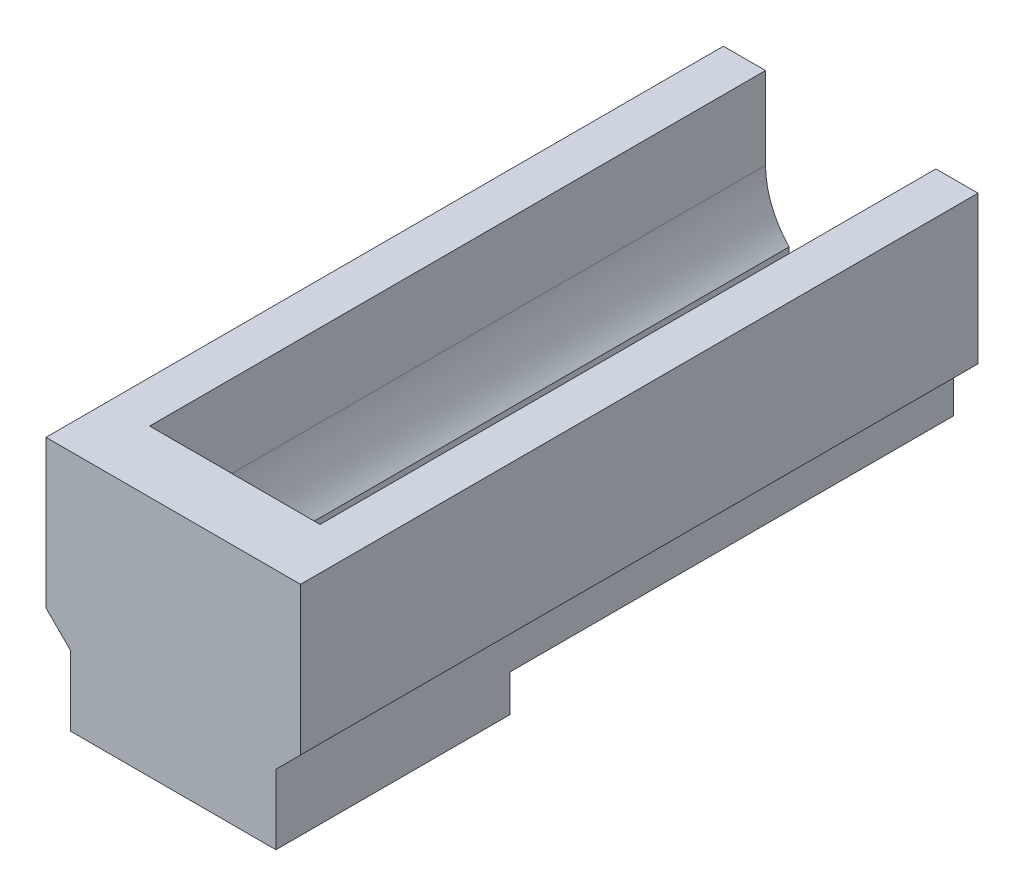
ISO-10303-21;
HEADER;
FILE_DESCRIPTION(('STEP AP214'),'2;1');
FILE_NAME('part.step','',(''),(''),'','','');
FILE_SCHEMA(('AUTOMOTIVE_DESIGN { 1 0 10303 214 1 1 1 1 }'));
ENDSEC;
DATA;
#1=APPLICATION_CONTEXT('core data for automotive mechanical design processes');
#2=APPLICATION_PROTOCOL_DEFINITION('international standard','automotive_design',2000,#1);
#3=PRODUCT_CONTEXT('',#1,'mechanical');
#4=PRODUCT('Part','Part','',(#3));
#5=PRODUCT_RELATED_PRODUCT_CATEGORY('part','',(#4));
#6=PRODUCT_DEFINITION_FORMATION('','',#4);
#7=PRODUCT_DEFINITION_CONTEXT('part definition',#1,'design');
#8=PRODUCT_DEFINITION('design','',#6,#7);
#9=PRODUCT_DEFINITION_SHAPE('','',#8);
#10=(LENGTH_UNIT() NAMED_UNIT(*) SI_UNIT(.MILLI.,.METRE.));
#11=(NAMED_UNIT(*) PLANE_ANGLE_UNIT() SI_UNIT($,.RADIAN.));
#12=(NAMED_UNIT(*) SI_UNIT($,.STERADIAN.) SOLID_ANGLE_UNIT());
#13=UNCERTAINTY_MEASURE_WITH_UNIT(LENGTH_MEASURE(1.E-05),#10,'distance_accuracy_value','');
#14=(GEOMETRIC_REPRESENTATION_CONTEXT(3) GLOBAL_UNCERTAINTY_ASSIGNED_CONTEXT((#13)) GLOBAL_UNIT_ASSIGNED_CONTEXT((#10,
#11,#12)) REPRESENTATION_CONTEXT('',''));
#15=CARTESIAN_POINT('',(0.,0.,0.));
#16=DIRECTION('',(0.,0.,1.));
#17=DIRECTION('',(1.,0.,0.));
#18=AXIS2_PLACEMENT_3D('',#15,#16,#17);
#19=CARTESIAN_POINT('',(-25.5,-32.5,-306.7));
#20=DIRECTION('',(0.,1.,0.));
#21=DIRECTION('',(0.,0.,1.));
#22=AXIS2_PLACEMENT_3D('',#19,#20,#21);
#23=PLANE('',#22);
#24=DIRECTION('',(1.,0.,0.));
#25=VECTOR('',#24,1.);
#26=CARTESIAN_POINT('',(-25.5,-32.5,-306.7));
#27=LINE('',#26,#25);
#28=CARTESIAN_POINT('',(-18.,-32.5,-306.7));
#29=VERTEX_POINT('',#28);
#30=CARTESIAN_POINT('',(-19.,-32.5,-306.7));
#31=VERTEX_POINT('',#30);
#32=EDGE_CURVE('E221',#29,#31,#27,.F.);
#33=ORIENTED_EDGE('',*,*,#32,.T.);
#34=DIRECTION('',(0.,0.,-1.));
#35=VECTOR('',#34,1.);
#36=CARTESIAN_POINT('',(-19.,-32.5,-302.5));
#37=LINE('',#36,#35);
#38=CARTESIAN_POINT('',(-19.,-32.5,-317.5));
#39=VERTEX_POINT('',#38);
#40=EDGE_CURVE('E158',#31,#39,#37,.T.);
#41=ORIENTED_EDGE('',*,*,#40,.T.);
#42=DIRECTION('',(1.,0.,0.));
#43=VECTOR('',#42,1.);
#44=CARTESIAN_POINT('',(-25.5,-32.5,-317.5));
#45=LINE('',#44,#43);
#46=CARTESIAN_POINT('',(-18.,-32.5,-317.5));
#47=VERTEX_POINT('',#46);
#48=EDGE_CURVE('E227',#47,#39,#45,.F.);
#49=ORIENTED_EDGE('',*,*,#48,.F.);
#50=DIRECTION('',(0.,0.,-1.));
#51=VECTOR('',#50,1.);
#52=CARTESIAN_POINT('',(-18.,-32.5,-301.));
#53=LINE('',#52,#51);
#54=EDGE_CURVE('E204',#29,#47,#53,.T.);
#55=ORIENTED_EDGE('',*,*,#54,.F.);
#56=EDGE_LOOP('',(#33,#41,#49,#55));
#57=FACE_BOUND('',#56,.T.);
#58=ADVANCED_FACE('F17',(#57),#23,.F.);
#59=CARTESIAN_POINT('',(-19.,-32.5,-302.5));
#60=DIRECTION('',(1.,0.,0.));
#61=DIRECTION('',(0.,0.,-1.));
#62=AXIS2_PLACEMENT_3D('',#59,#60,#61);
#63=PLANE('',#62);
#64=ORIENTED_EDGE('',*,*,#40,.F.);
#65=DIRECTION('',(0.,0.,-1.));
#66=VECTOR('',#65,1.);
#67=CARTESIAN_POINT('',(-19.,-32.5,-302.5));
#68=LINE('',#67,#66);
#69=CARTESIAN_POINT('',(-19.,-32.5,-302.5));
#70=VERTEX_POINT('',#69);
#71=EDGE_CURVE('E191',#31,#70,#68,.F.);
#72=ORIENTED_EDGE('',*,*,#71,.T.);
#73=DIRECTION('',(0.,1.,0.));
#74=VECTOR('',#73,1.);
#75=CARTESIAN_POINT('',(-19.,-32.5,-302.5));
#76=LINE('',#75,#74);
#77=CARTESIAN_POINT('',(-19.,-30.933745095894,-302.5));
#78=VERTEX_POINT('',#77);
#79=EDGE_CURVE('E229',#78,#70,#76,.F.);
#80=ORIENTED_EDGE('',*,*,#79,.F.);
#81=DIRECTION('',(0.,0.,1.));
#82=VECTOR('',#81,1.);
#83=CARTESIAN_POINT('',(-19.,-30.933745095894,-302.5));
#84=LINE('',#83,#82);
#85=CARTESIAN_POINT('',(-19.,-30.933745095894,-317.5));
#86=VERTEX_POINT('',#85);
#87=EDGE_CURVE('E182',#78,#86,#84,.F.);
#88=ORIENTED_EDGE('',*,*,#87,.T.);
#89=DIRECTION('',(0.,1.,0.));
#90=VECTOR('',#89,1.);
#91=CARTESIAN_POINT('',(-19.,-27.5,-317.5));
#92=LINE('',#91,#90);
#93=EDGE_CURVE('E186',#86,#39,#92,.F.);
#94=ORIENTED_EDGE('',*,*,#93,.T.);
#95=EDGE_LOOP('',(#64,#72,#80,#88,#94));
#96=FACE_BOUND('',#95,.T.);
#97=ADVANCED_FACE('F586',(#96),#63,.F.);
#98=CARTESIAN_POINT('',(-22.,-30.933745095894,-302.5));
#99=DIRECTION('',(-1.,0.,0.));
#100=DIRECTION('',(0.,0.,1.));
#101=AXIS2_PLACEMENT_3D('',#98,#99,#100);
#102=PLANE('',#101);
#103=DIRECTION('',(0.,0.,1.));
#104=VECTOR('',#103,1.);
#105=CARTESIAN_POINT('',(-22.,-30.933745095894,-302.5));
#106=LINE('',#105,#104);
#107=CARTESIAN_POINT('',(-22.,-30.933745095894,-317.5));
#108=VERTEX_POINT('',#107);
#109=CARTESIAN_POINT('',(-22.,-30.933745095894,-302.5));
#110=VERTEX_POINT('',#109);
#111=EDGE_CURVE('E161',#108,#110,#106,.T.);
#112=ORIENTED_EDGE('',*,*,#111,.T.);
#113=DIRECTION('',(0.,1.,0.));
#114=VECTOR('',#113,1.);
#115=CARTESIAN_POINT('',(-22.,-30.933745095894,-302.5));
#116=LINE('',#115,#114);
#117=CARTESIAN_POINT('',(-22.,-32.5,-302.5));
#118=VERTEX_POINT('',#117);
#119=EDGE_CURVE('E145',#118,#110,#116,.T.);
#120=ORIENTED_EDGE('',*,*,#119,.F.);
#121=DIRECTION('',(0.,0.,-1.));
#122=VECTOR('',#121,1.);
#123=CARTESIAN_POINT('',(-22.,-32.5,-302.5));
#124=LINE('',#123,#122);
#125=CARTESIAN_POINT('',(-22.,-32.5,-306.7));
#126=VERTEX_POINT('',#125);
#127=EDGE_CURVE('E212',#118,#126,#124,.T.);
#128=ORIENTED_EDGE('',*,*,#127,.T.);
#129=DIRECTION('',(0.,0.,1.));
#130=VECTOR('',#129,1.);
#131=CARTESIAN_POINT('',(-22.,-32.5,-306.7));
#132=LINE('',#131,#130);
#133=CARTESIAN_POINT('',(-22.,-32.5,-317.5));
#134=VERTEX_POINT('',#133);
#135=EDGE_CURVE('E241',#126,#134,#132,.F.);
#136=ORIENTED_EDGE('',*,*,#135,.T.);
#137=DIRECTION('',(0.,1.,0.));
#138=VECTOR('',#137,1.);
#139=CARTESIAN_POINT('',(-22.,-30.933745095894,-317.5));
#140=LINE('',#139,#138);
#141=EDGE_CURVE('E157',#108,#134,#140,.F.);
#142=ORIENTED_EDGE('',*,*,#141,.F.);
#143=EDGE_LOOP('',(#112,#120,#128,#136,#142));
#144=FACE_BOUND('',#143,.T.);
#145=ADVANCED_FACE('F162',(#144),#102,.F.);
#146=CARTESIAN_POINT('',(-25.5,-32.5,-306.7));
#147=DIRECTION('',(0.,1.,0.));
#148=DIRECTION('',(0.,0.,1.));
#149=AXIS2_PLACEMENT_3D('',#146,#147,#148);
#150=PLANE('',#149);
#151=DIRECTION('',(1.,0.,0.));
#152=VECTOR('',#151,1.);
#153=CARTESIAN_POINT('',(-25.5,-32.5,-317.5));
#154=LINE('',#153,#152);
#155=CARTESIAN_POINT('',(-23.,-32.5,-317.5));
#156=VERTEX_POINT('',#155);
#157=EDGE_CURVE('E224',#134,#156,#154,.F.);
#158=ORIENTED_EDGE('',*,*,#157,.F.);
#159=ORIENTED_EDGE('',*,*,#135,.F.);
#160=DIRECTION('',(1.,0.,0.));
#161=VECTOR('',#160,1.);
#162=CARTESIAN_POINT('',(-25.5,-32.5,-306.7));
#163=LINE('',#162,#161);
#164=CARTESIAN_POINT('',(-23.,-32.5,-306.7));
#165=VERTEX_POINT('',#164);
#166=EDGE_CURVE('E223',#126,#165,#163,.F.);
#167=ORIENTED_EDGE('',*,*,#166,.T.);
#168=DIRECTION('',(0.,0.,1.));
#169=VECTOR('',#168,1.);
#170=CARTESIAN_POINT('',(-23.,-32.5,-301.));
#171=LINE('',#170,#169);
#172=EDGE_CURVE('E196',#156,#165,#171,.T.);
#173=ORIENTED_EDGE('',*,*,#172,.F.);
#174=EDGE_LOOP('',(#158,#159,#167,#173));
#175=FACE_BOUND('',#174,.T.);
#176=ADVANCED_FACE('F398',(#175),#150,.F.);
#177=CARTESIAN_POINT('',(-20.5,-32.95,-304.5));
#178=DIRECTION('',(0.,1.,0.));
#179=DIRECTION('',(0.,0.,1.));
#180=AXIS2_PLACEMENT_3D('',#177,#178,#179);
#181=CYLINDRICAL_SURFACE('',#180,1.45);
#182=CARTESIAN_POINT('',(-20.5,-33.4,-304.5));
#183=DIRECTION('',(0.,1.,0.));
#184=DIRECTION('',(0.,0.,1.));
#185=AXIS2_PLACEMENT_3D('',#182,#183,#184);
#186=CIRCLE('',#185,1.45);
#187=CARTESIAN_POINT('',(-20.5,-33.4,-303.05));
#188=VERTEX_POINT('',#187);
#189=EDGE_CURVE('E192',#188,#188,#186,.T.);
#190=ORIENTED_EDGE('',*,*,#189,.F.);
#191=EDGE_LOOP('',(#190));
#192=FACE_BOUND('',#191,.T.);
#193=CARTESIAN_POINT('',(-20.5,-32.5,-304.5));
#194=DIRECTION('',(0.,1.,0.));
#195=DIRECTION('',(0.,0.,1.));
#196=AXIS2_PLACEMENT_3D('',#193,#194,#195);
#197=CIRCLE('',#196,1.45);
#198=CARTESIAN_POINT('',(-20.5,-32.5,-303.05));
#199=VERTEX_POINT('',#198);
#200=EDGE_CURVE('E188',#199,#199,#197,.T.);
#201=ORIENTED_EDGE('',*,*,#200,.T.);
#202=EDGE_LOOP('',(#201));
#203=FACE_BOUND('',#202,.T.);
#204=ADVANCED_FACE('F563',(#192,#203),#181,.F.);
#205=CARTESIAN_POINT('',(-25.5,-33.4,-306.7));
#206=DIRECTION('',(0.,0.,1.));
#207=DIRECTION('',(0.,-1.,0.));
#208=AXIS2_PLACEMENT_3D('',#205,#206,#207);
#209=PLANE('',#208);
#210=ORIENTED_EDGE('',*,*,#166,.F.);
#211=DIRECTION('',(1.,0.,0.));
#212=VECTOR('',#211,1.);
#213=CARTESIAN_POINT('',(-22.,-32.5,-306.7));
#214=LINE('',#213,#212);
#215=EDGE_CURVE('E215',#126,#31,#214,.T.);
#216=ORIENTED_EDGE('',*,*,#215,.T.);
#217=ORIENTED_EDGE('',*,*,#32,.F.);
#218=DIRECTION('',(0.,1.,0.));
#219=VECTOR('',#218,1.);
#220=CARTESIAN_POINT('',(-18.,-33.4,-306.7));
#221=LINE('',#220,#219);
#222=CARTESIAN_POINT('',(-18.,-33.4,-306.7));
#223=VERTEX_POINT('',#222);
#224=EDGE_CURVE('E207',#223,#29,#221,.T.);
#225=ORIENTED_EDGE('',*,*,#224,.F.);
#226=DIRECTION('',(1.,0.,0.));
#227=VECTOR('',#226,1.);
#228=CARTESIAN_POINT('',(-23.,-33.4,-306.7));
#229=LINE('',#228,#227);
#230=CARTESIAN_POINT('',(-23.,-33.4,-306.7));
#231=VERTEX_POINT('',#230);
#232=EDGE_CURVE('E195',#231,#223,#229,.T.);
#233=ORIENTED_EDGE('',*,*,#232,.F.);
#234=DIRECTION('',(0.,1.,0.));
#235=VECTOR('',#234,1.);
#236=CARTESIAN_POINT('',(-23.,-31.7,-306.7));
#237=LINE('',#236,#235);
#238=EDGE_CURVE('E218',#165,#231,#237,.F.);
#239=ORIENTED_EDGE('',*,*,#238,.F.);
#240=EDGE_LOOP('',(#210,#216,#217,#225,#233,#239));
#241=FACE_BOUND('',#240,.T.);
#242=ADVANCED_FACE('F402',(#241),#209,.F.);
#243=CARTESIAN_POINT('',(-18.,-33.4,-301.));
#244=DIRECTION('',(1.,0.,0.));
#245=DIRECTION('',(0.,0.,-1.));
#246=AXIS2_PLACEMENT_3D('',#243,#244,#245);
#247=PLANE('',#246);
#248=DIRECTION('',(0.,1.,0.));
#249=VECTOR('',#248,1.);
#250=CARTESIAN_POINT('',(-18.,-33.4,-301.));
#251=LINE('',#250,#249);
#252=CARTESIAN_POINT('',(-18.,-31.7,-301.));
#253=VERTEX_POINT('',#252);
#254=CARTESIAN_POINT('',(-18.,-33.4,-301.));
#255=VERTEX_POINT('',#254);
#256=EDGE_CURVE('E166',#253,#255,#251,.F.);
#257=ORIENTED_EDGE('',*,*,#256,.T.);
#258=DIRECTION('',(0.,0.,-1.));
#259=VECTOR('',#258,1.);
#260=CARTESIAN_POINT('',(-18.,-33.4,-301.));
#261=LINE('',#260,#259);
#262=EDGE_CURVE('E322',#223,#255,#261,.F.);
#263=ORIENTED_EDGE('',*,*,#262,.F.);
#264=ORIENTED_EDGE('',*,*,#224,.T.);
#265=ORIENTED_EDGE('',*,*,#54,.T.);
#266=DIRECTION('',(0.,1.,0.));
#267=VECTOR('',#266,1.);
#268=CARTESIAN_POINT('',(-18.,-27.5,-317.5));
#269=LINE('',#268,#267);
#270=CARTESIAN_POINT('',(-18.,-31.7,-317.5));
#271=VERTEX_POINT('',#270);
#272=EDGE_CURVE('E199',#47,#271,#269,.T.);
#273=ORIENTED_EDGE('',*,*,#272,.T.);
#274=DIRECTION('',(0.,0.,1.));
#275=VECTOR('',#274,1.);
#276=CARTESIAN_POINT('',(-18.,-31.7,-301.));
#277=LINE('',#276,#275);
#278=EDGE_CURVE('E177',#253,#271,#277,.F.);
#279=ORIENTED_EDGE('',*,*,#278,.F.);
#280=EDGE_LOOP('',(#257,#263,#264,#265,#273,#279));
#281=FACE_BOUND('',#280,.T.);
#282=ADVANCED_FACE('F381',(#281),#247,.T.);
#283=CARTESIAN_POINT('',(-20.5,-29.5,-302.5));
#284=DIRECTION('',(0.,0.,1.));
#285=DIRECTION('',(1.,0.,0.));
#286=AXIS2_PLACEMENT_3D('',#283,#284,#285);
#287=CYLINDRICAL_SURFACE('',#286,2.075);
#288=DIRECTION('',(0.,0.,1.));
#289=VECTOR('',#288,1.);
#290=CARTESIAN_POINT('',(-22.575,-29.5,-302.5));
#291=LINE('',#290,#289);
#292=CARTESIAN_POINT('',(-22.575,-29.5,-317.5));
#293=VERTEX_POINT('',#292);
#294=CARTESIAN_POINT('',(-22.575,-29.5,-302.5));
#295=VERTEX_POINT('',#294);
#296=EDGE_CURVE('E170',#293,#295,#291,.T.);
#297=ORIENTED_EDGE('',*,*,#296,.T.);
#298=CARTESIAN_POINT('',(-20.5,-29.5,-302.5));
#299=DIRECTION('',(0.,0.,1.));
#300=DIRECTION('',(1.,0.,0.));
#301=AXIS2_PLACEMENT_3D('',#298,#299,#300);
#302=CIRCLE('',#301,2.075);
#303=EDGE_CURVE('E20',#110,#295,#302,.F.);
#304=ORIENTED_EDGE('',*,*,#303,.F.);
#305=ORIENTED_EDGE('',*,*,#111,.F.);
#306=CARTESIAN_POINT('',(-20.5,-29.5,-317.5));
#307=DIRECTION('',(0.,0.,1.));
#308=DIRECTION('',(1.,0.,0.));
#309=AXIS2_PLACEMENT_3D('',#306,#307,#308);
#310=CIRCLE('',#309,2.075);
#311=EDGE_CURVE('E172',#293,#108,#310,.T.);
#312=ORIENTED_EDGE('',*,*,#311,.F.);
#313=EDGE_LOOP('',(#297,#304,#305,#312));
#314=FACE_BOUND('',#313,.T.);
#315=ADVANCED_FACE('F168',(#314),#287,.F.);
#316=CARTESIAN_POINT('',(-18.,-31.7,-301.));
#317=DIRECTION('',(0.707106781186548,-0.707106781186548,0.));
#318=DIRECTION('',(0.707106781186548,0.707106781186548,0.));
#319=AXIS2_PLACEMENT_3D('',#316,#317,#318);
#320=PLANE('',#319);
#321=DIRECTION('',(0.707106781186548,0.707106781186548,0.));
#322=VECTOR('',#321,1.);
#323=CARTESIAN_POINT('',(-18.,-31.7,-301.));
#324=LINE('',#323,#322);
#325=CARTESIAN_POINT('',(-17.4,-31.1,-301.));
#326=VERTEX_POINT('',#325);
#327=EDGE_CURVE('E173',#326,#253,#324,.F.);
#328=ORIENTED_EDGE('',*,*,#327,.T.);
#329=ORIENTED_EDGE('',*,*,#278,.T.);
#330=DIRECTION('',(0.707106781186552,0.707106781186543,0.));
#331=VECTOR('',#330,1.);
#332=CARTESIAN_POINT('',(-18.,-31.7,-317.5));
#333=LINE('',#332,#331);
#334=CARTESIAN_POINT('',(-17.4,-31.1,-317.5));
#335=VERTEX_POINT('',#334);
#336=EDGE_CURVE('E201',#271,#335,#333,.T.);
#337=ORIENTED_EDGE('',*,*,#336,.T.);
#338=DIRECTION('',(0.,0.,-1.));
#339=VECTOR('',#338,1.);
#340=CARTESIAN_POINT('',(-17.4,-31.1,-301.));
#341=LINE('',#340,#339);
#342=EDGE_CURVE('E264',#326,#335,#341,.T.);
#343=ORIENTED_EDGE('',*,*,#342,.F.);
#344=EDGE_LOOP('',(#328,#329,#337,#343));
#345=FACE_BOUND('',#344,.T.);
#346=ADVANCED_FACE('F385',(#345),#320,.T.);
#347=CARTESIAN_POINT('',(-20.5,-29.5,-302.5));
#348=DIRECTION('',(0.,0.,1.));
#349=DIRECTION('',(1.,0.,0.));
#350=AXIS2_PLACEMENT_3D('',#347,#348,#349);
#351=CYLINDRICAL_SURFACE('',#350,2.075);
#352=ORIENTED_EDGE('',*,*,#87,.F.);
#353=CARTESIAN_POINT('',(-20.5,-29.5,-302.5));
#354=DIRECTION('',(0.,0.,1.));
#355=DIRECTION('',(1.,0.,0.));
#356=AXIS2_PLACEMENT_3D('',#353,#354,#355);
#357=CIRCLE('',#356,2.075);
#358=CARTESIAN_POINT('',(-18.425,-29.5,-302.5));
#359=VERTEX_POINT('',#358);
#360=EDGE_CURVE('E180',#359,#78,#357,.F.);
#361=ORIENTED_EDGE('',*,*,#360,.F.);
#362=DIRECTION('',(0.,0.,-1.));
#363=VECTOR('',#362,1.);
#364=CARTESIAN_POINT('',(-18.425,-29.5,-302.5));
#365=LINE('',#364,#363);
#366=CARTESIAN_POINT('',(-18.425,-29.5,-317.5));
#367=VERTEX_POINT('',#366);
#368=EDGE_CURVE('E284',#359,#367,#365,.T.);
#369=ORIENTED_EDGE('',*,*,#368,.T.);
#370=CARTESIAN_POINT('',(-20.5,-29.5,-317.5));
#371=DIRECTION('',(0.,0.,1.));
#372=DIRECTION('',(1.,0.,0.));
#373=AXIS2_PLACEMENT_3D('',#370,#371,#372);
#374=CIRCLE('',#373,2.075);
#375=EDGE_CURVE('E183',#367,#86,#374,.F.);
#376=ORIENTED_EDGE('',*,*,#375,.T.);
#377=EDGE_LOOP('',(#352,#361,#369,#376));
#378=FACE_BOUND('',#377,.T.);
#379=ADVANCED_FACE('F526',(#378),#351,.F.);
#380=CARTESIAN_POINT('',(-20.5,-27.5,-317.5));
#381=DIRECTION('',(0.,0.,1.));
#382=DIRECTION('',(1.,0.,0.));
#383=AXIS2_PLACEMENT_3D('',#380,#381,#382);
#384=PLANE('',#383);
#385=ORIENTED_EDGE('',*,*,#93,.F.);
#386=ORIENTED_EDGE('',*,*,#375,.F.);
#387=DIRECTION('',(0.,1.,0.));
#388=VECTOR('',#387,1.);
#389=CARTESIAN_POINT('',(-18.425,-29.5,-317.5));
#390=LINE('',#389,#388);
#391=CARTESIAN_POINT('',(-18.425,-27.5,-317.5));
#392=VERTEX_POINT('',#391);
#393=EDGE_CURVE('E281',#367,#392,#390,.T.);
#394=ORIENTED_EDGE('',*,*,#393,.T.);
#395=DIRECTION('',(1.,0.,0.));
#396=VECTOR('',#395,1.);
#397=CARTESIAN_POINT('',(-20.5,-27.5,-317.5));
#398=LINE('',#397,#396);
#399=CARTESIAN_POINT('',(-17.4,-27.5,-317.5));
#400=VERTEX_POINT('',#399);
#401=EDGE_CURVE('E187',#400,#392,#398,.F.);
#402=ORIENTED_EDGE('',*,*,#401,.F.);
#403=DIRECTION('',(0.,1.,0.));
#404=VECTOR('',#403,1.);
#405=CARTESIAN_POINT('',(-17.4,-31.1,-317.5));
#406=LINE('',#405,#404);
#407=EDGE_CURVE('E261',#335,#400,#406,.T.);
#408=ORIENTED_EDGE('',*,*,#407,.F.);
#409=ORIENTED_EDGE('',*,*,#336,.F.);
#410=ORIENTED_EDGE('',*,*,#272,.F.);
#411=ORIENTED_EDGE('',*,*,#48,.T.);
#412=EDGE_LOOP('',(#385,#386,#394,#402,#408,#409,#410,#411));
#413=FACE_BOUND('',#412,.T.);
#414=ADVANCED_FACE('F407',(#413),#384,.F.);
#415=CARTESIAN_POINT('',(-22.,-32.5,-302.5));
#416=DIRECTION('',(0.,-1.,0.));
#417=DIRECTION('',(0.,0.,-1.));
#418=AXIS2_PLACEMENT_3D('',#415,#416,#417);
#419=PLANE('',#418);
#420=ORIENTED_EDGE('',*,*,#127,.F.);
#421=DIRECTION('',(1.,0.,0.));
#422=VECTOR('',#421,1.);
#423=CARTESIAN_POINT('',(-20.5,-32.5,-302.5));
#424=LINE('',#423,#422);
#425=EDGE_CURVE('E153',#118,#70,#424,.T.);
#426=ORIENTED_EDGE('',*,*,#425,.T.);
#427=ORIENTED_EDGE('',*,*,#71,.F.);
#428=ORIENTED_EDGE('',*,*,#215,.F.);
#429=EDGE_LOOP('',(#420,#426,#427,#428));
#430=FACE_BOUND('',#429,.T.);
#431=ORIENTED_EDGE('',*,*,#200,.F.);
#432=EDGE_LOOP('',(#431));
#433=FACE_BOUND('',#432,.T.);
#434=ADVANCED_FACE('F511',(#430,#433),#419,.F.);
#435=CARTESIAN_POINT('',(-23.,-31.7,-301.));
#436=DIRECTION('',(-1.,0.,0.));
#437=DIRECTION('',(0.,0.,1.));
#438=AXIS2_PLACEMENT_3D('',#435,#436,#437);
#439=PLANE('',#438);
#440=DIRECTION('',(0.,1.,0.));
#441=VECTOR('',#440,1.);
#442=CARTESIAN_POINT('',(-23.,-27.5,-317.5));
#443=LINE('',#442,#441);
#444=CARTESIAN_POINT('',(-23.,-31.7,-317.5));
#445=VERTEX_POINT('',#444);
#446=EDGE_CURVE('E339',#445,#156,#443,.F.);
#447=ORIENTED_EDGE('',*,*,#446,.T.);
#448=ORIENTED_EDGE('',*,*,#172,.T.);
#449=ORIENTED_EDGE('',*,*,#238,.T.);
#450=DIRECTION('',(0.,0.,-1.));
#451=VECTOR('',#450,1.);
#452=CARTESIAN_POINT('',(-23.,-33.4,-301.));
#453=LINE('',#452,#451);
#454=CARTESIAN_POINT('',(-23.,-33.4,-301.));
#455=VERTEX_POINT('',#454);
#456=EDGE_CURVE('E313',#455,#231,#453,.T.);
#457=ORIENTED_EDGE('',*,*,#456,.F.);
#458=DIRECTION('',(0.,1.,0.));
#459=VECTOR('',#458,1.);
#460=CARTESIAN_POINT('',(-23.,-31.7,-301.));
#461=LINE('',#460,#459);
#462=CARTESIAN_POINT('',(-23.,-31.7,-301.));
#463=VERTEX_POINT('',#462);
#464=EDGE_CURVE('E316',#455,#463,#461,.T.);
#465=ORIENTED_EDGE('',*,*,#464,.T.);
#466=DIRECTION('',(0.,0.,1.));
#467=VECTOR('',#466,1.);
#468=CARTESIAN_POINT('',(-23.,-31.7,-301.));
#469=LINE('',#468,#467);
#470=EDGE_CURVE('E345',#445,#463,#469,.T.);
#471=ORIENTED_EDGE('',*,*,#470,.F.);
#472=EDGE_LOOP('',(#447,#448,#449,#457,#465,#471));
#473=FACE_BOUND('',#472,.T.);
#474=ADVANCED_FACE('F371',(#473),#439,.T.);
#475=CARTESIAN_POINT('',(-23.,-33.4,-301.));
#476=DIRECTION('',(0.,-1.,0.));
#477=DIRECTION('',(0.,0.,-1.));
#478=AXIS2_PLACEMENT_3D('',#475,#476,#477);
#479=PLANE('',#478);
#480=DIRECTION('',(1.,0.,0.));
#481=VECTOR('',#480,1.);
#482=CARTESIAN_POINT('',(-20.5,-33.4,-301.));
#483=LINE('',#482,#481);
#484=EDGE_CURVE('E351',#455,#255,#483,.T.);
#485=ORIENTED_EDGE('',*,*,#484,.F.);
#486=ORIENTED_EDGE('',*,*,#456,.T.);
#487=ORIENTED_EDGE('',*,*,#232,.T.);
#488=ORIENTED_EDGE('',*,*,#262,.T.);
#489=EDGE_LOOP('',(#485,#486,#487,#488));
#490=FACE_BOUND('',#489,.T.);
#491=ORIENTED_EDGE('',*,*,#189,.T.);
#492=EDGE_LOOP('',(#491));
#493=FACE_BOUND('',#492,.T.);
#494=ADVANCED_FACE('F375',(#490,#493),#479,.T.);
#495=CARTESIAN_POINT('',(-22.575,-27.5,-302.5));
#496=DIRECTION('',(-1.,0.,0.));
#497=DIRECTION('',(0.,0.,1.));
#498=AXIS2_PLACEMENT_3D('',#495,#496,#497);
#499=PLANE('',#498);
#500=DIRECTION('',(0.,0.,1.));
#501=VECTOR('',#500,1.);
#502=CARTESIAN_POINT('',(-22.575,-27.5,-301.));
#503=LINE('',#502,#501);
#504=CARTESIAN_POINT('',(-22.575,-27.5,-302.5));
#505=VERTEX_POINT('',#504);
#506=CARTESIAN_POINT('',(-22.575,-27.5,-317.5));
#507=VERTEX_POINT('',#506);
#508=EDGE_CURVE('E303',#505,#507,#503,.F.);
#509=ORIENTED_EDGE('',*,*,#508,.F.);
#510=DIRECTION('',(0.,1.,0.));
#511=VECTOR('',#510,1.);
#512=CARTESIAN_POINT('',(-22.575,-27.5,-302.5));
#513=LINE('',#512,#511);
#514=EDGE_CURVE('E234',#505,#295,#513,.F.);
#515=ORIENTED_EDGE('',*,*,#514,.T.);
#516=ORIENTED_EDGE('',*,*,#296,.F.);
#517=DIRECTION('',(0.,1.,0.));
#518=VECTOR('',#517,1.);
#519=CARTESIAN_POINT('',(-22.575,-27.5,-317.5));
#520=LINE('',#519,#518);
#521=EDGE_CURVE('E335',#293,#507,#520,.T.);
#522=ORIENTED_EDGE('',*,*,#521,.T.);
#523=EDGE_LOOP('',(#509,#515,#516,#522));
#524=FACE_BOUND('',#523,.T.);
#525=ADVANCED_FACE('F416',(#524),#499,.F.);
#526=CARTESIAN_POINT('',(-17.4,-31.1,-301.));
#527=DIRECTION('',(1.,0.,0.));
#528=DIRECTION('',(0.,0.,-1.));
#529=AXIS2_PLACEMENT_3D('',#526,#527,#528);
#530=PLANE('',#529);
#531=DIRECTION('',(0.,1.,0.));
#532=VECTOR('',#531,1.);
#533=CARTESIAN_POINT('',(-17.4,-27.5,-301.));
#534=LINE('',#533,#532);
#535=CARTESIAN_POINT('',(-17.4,-27.5,-301.));
#536=VERTEX_POINT('',#535);
#537=EDGE_CURVE('E307',#326,#536,#534,.T.);
#538=ORIENTED_EDGE('',*,*,#537,.F.);
#539=ORIENTED_EDGE('',*,*,#342,.T.);
#540=ORIENTED_EDGE('',*,*,#407,.T.);
#541=DIRECTION('',(0.,0.,1.));
#542=VECTOR('',#541,1.);
#543=CARTESIAN_POINT('',(-17.4,-27.5,-301.));
#544=LINE('',#543,#542);
#545=EDGE_CURVE('E255',#536,#400,#544,.F.);
#546=ORIENTED_EDGE('',*,*,#545,.F.);
#547=EDGE_LOOP('',(#538,#539,#540,#546));
#548=FACE_BOUND('',#547,.T.);
#549=ADVANCED_FACE('F390',(#548),#530,.T.);
#550=CARTESIAN_POINT('',(-18.425,-29.5,-302.5));
#551=DIRECTION('',(1.,0.,0.));
#552=DIRECTION('',(0.,0.,-1.));
#553=AXIS2_PLACEMENT_3D('',#550,#551,#552);
#554=PLANE('',#553);
#555=ORIENTED_EDGE('',*,*,#368,.F.);
#556=DIRECTION('',(0.,1.,0.));
#557=VECTOR('',#556,1.);
#558=CARTESIAN_POINT('',(-18.425,-27.5,-302.5));
#559=LINE('',#558,#557);
#560=CARTESIAN_POINT('',(-18.425,-27.5,-302.5));
#561=VERTEX_POINT('',#560);
#562=EDGE_CURVE('E233',#359,#561,#559,.T.);
#563=ORIENTED_EDGE('',*,*,#562,.T.);
#564=DIRECTION('',(0.,0.,1.));
#565=VECTOR('',#564,1.);
#566=CARTESIAN_POINT('',(-18.425,-27.5,-301.));
#567=LINE('',#566,#565);
#568=EDGE_CURVE('E258',#392,#561,#567,.T.);
#569=ORIENTED_EDGE('',*,*,#568,.F.);
#570=ORIENTED_EDGE('',*,*,#393,.F.);
#571=EDGE_LOOP('',(#555,#563,#569,#570));
#572=FACE_BOUND('',#571,.T.);
#573=ADVANCED_FACE('F414',(#572),#554,.F.);
#574=CARTESIAN_POINT('',(-20.5,-27.5,-302.5));
#575=DIRECTION('',(0.,0.,1.));
#576=DIRECTION('',(1.,0.,0.));
#577=AXIS2_PLACEMENT_3D('',#574,#575,#576);
#578=PLANE('',#577);
#579=ORIENTED_EDGE('',*,*,#562,.F.);
#580=ORIENTED_EDGE('',*,*,#360,.T.);
#581=ORIENTED_EDGE('',*,*,#79,.T.);
#582=ORIENTED_EDGE('',*,*,#425,.F.);
#583=ORIENTED_EDGE('',*,*,#119,.T.);
#584=ORIENTED_EDGE('',*,*,#303,.T.);
#585=ORIENTED_EDGE('',*,*,#514,.F.);
#586=DIRECTION('',(1.,0.,0.));
#587=VECTOR('',#586,1.);
#588=CARTESIAN_POINT('',(-17.4,-27.5,-302.5));
#589=LINE('',#588,#587);
#590=EDGE_CURVE('E294',#561,#505,#589,.F.);
#591=ORIENTED_EDGE('',*,*,#590,.F.);
#592=EDGE_LOOP('',(#579,#580,#581,#582,#583,#584,#585,#591));
#593=FACE_BOUND('',#592,.T.);
#594=ADVANCED_FACE('F148',(#593),#578,.F.);
#595=CARTESIAN_POINT('',(-20.5,-27.5,-317.5));
#596=DIRECTION('',(0.,0.,1.));
#597=DIRECTION('',(1.,0.,0.));
#598=AXIS2_PLACEMENT_3D('',#595,#596,#597);
#599=PLANE('',#598);
#600=ORIENTED_EDGE('',*,*,#446,.F.);
#601=DIRECTION('',(0.707106781186548,-0.707106781186548,0.));
#602=VECTOR('',#601,1.);
#603=CARTESIAN_POINT('',(-23.6,-31.1,-317.5));
#604=LINE('',#603,#602);
#605=CARTESIAN_POINT('',(-23.6,-31.1,-317.5));
#606=VERTEX_POINT('',#605);
#607=EDGE_CURVE('E342',#606,#445,#604,.T.);
#608=ORIENTED_EDGE('',*,*,#607,.F.);
#609=DIRECTION('',(0.,1.,0.));
#610=VECTOR('',#609,1.);
#611=CARTESIAN_POINT('',(-23.6,-27.5,-317.5));
#612=LINE('',#611,#610);
#613=CARTESIAN_POINT('',(-23.6,-27.5,-317.5));
#614=VERTEX_POINT('',#613);
#615=EDGE_CURVE('E299',#614,#606,#612,.F.);
#616=ORIENTED_EDGE('',*,*,#615,.F.);
#617=DIRECTION('',(1.,0.,0.));
#618=VECTOR('',#617,1.);
#619=CARTESIAN_POINT('',(-17.4,-27.5,-317.5));
#620=LINE('',#619,#618);
#621=EDGE_CURVE('E306',#507,#614,#620,.F.);
#622=ORIENTED_EDGE('',*,*,#621,.F.);
#623=ORIENTED_EDGE('',*,*,#521,.F.);
#624=ORIENTED_EDGE('',*,*,#311,.T.);
#625=ORIENTED_EDGE('',*,*,#141,.T.);
#626=ORIENTED_EDGE('',*,*,#157,.T.);
#627=EDGE_LOOP('',(#600,#608,#616,#622,#623,#624,#625,#626));
#628=FACE_BOUND('',#627,.T.);
#629=ADVANCED_FACE('F394',(#628),#599,.F.);
#630=CARTESIAN_POINT('',(-23.6,-31.1,-301.));
#631=DIRECTION('',(-0.707106781186548,-0.707106781186548,0.));
#632=DIRECTION('',(0.707106781186548,-0.707106781186548,0.));
#633=AXIS2_PLACEMENT_3D('',#630,#631,#632);
#634=PLANE('',#633);
#635=DIRECTION('',(0.707106781186552,-0.707106781186543,0.));
#636=VECTOR('',#635,1.);
#637=CARTESIAN_POINT('',(-23.6,-31.1,-301.));
#638=LINE('',#637,#636);
#639=CARTESIAN_POINT('',(-23.6,-31.1,-301.));
#640=VERTEX_POINT('',#639);
#641=EDGE_CURVE('E348',#640,#463,#638,.T.);
#642=ORIENTED_EDGE('',*,*,#641,.F.);
#643=DIRECTION('',(0.,0.,1.));
#644=VECTOR('',#643,1.);
#645=CARTESIAN_POINT('',(-23.6,-31.1,-301.));
#646=LINE('',#645,#644);
#647=EDGE_CURVE('E358',#606,#640,#646,.T.);
#648=ORIENTED_EDGE('',*,*,#647,.F.);
#649=ORIENTED_EDGE('',*,*,#607,.T.);
#650=ORIENTED_EDGE('',*,*,#470,.T.);
#651=EDGE_LOOP('',(#642,#648,#649,#650));
#652=FACE_BOUND('',#651,.T.);
#653=ADVANCED_FACE('F368',(#652),#634,.T.);
#654=CARTESIAN_POINT('',(-20.5,-27.5,-301.));
#655=DIRECTION('',(0.,0.,1.));
#656=DIRECTION('',(1.,0.,0.));
#657=AXIS2_PLACEMENT_3D('',#654,#655,#656);
#658=PLANE('',#657);
#659=ORIENTED_EDGE('',*,*,#327,.F.);
#660=ORIENTED_EDGE('',*,*,#537,.T.);
#661=DIRECTION('',(1.,0.,0.));
#662=VECTOR('',#661,1.);
#663=CARTESIAN_POINT('',(-17.4,-27.5,-301.));
#664=LINE('',#663,#662);
#665=CARTESIAN_POINT('',(-23.6,-27.5,-301.));
#666=VERTEX_POINT('',#665);
#667=EDGE_CURVE('E35',#666,#536,#664,.T.);
#668=ORIENTED_EDGE('',*,*,#667,.F.);
#669=DIRECTION('',(0.,1.,0.));
#670=VECTOR('',#669,1.);
#671=CARTESIAN_POINT('',(-23.6,-27.5,-301.));
#672=LINE('',#671,#670);
#673=EDGE_CURVE('E26',#640,#666,#672,.T.);
#674=ORIENTED_EDGE('',*,*,#673,.F.);
#675=ORIENTED_EDGE('',*,*,#641,.T.);
#676=ORIENTED_EDGE('',*,*,#464,.F.);
#677=ORIENTED_EDGE('',*,*,#484,.T.);
#678=ORIENTED_EDGE('',*,*,#256,.F.);
#679=EDGE_LOOP('',(#659,#660,#668,#674,#675,#676,#677,#678));
#680=FACE_BOUND('',#679,.T.);
#681=ADVANCED_FACE('F365',(#680),#658,.T.);
#682=CARTESIAN_POINT('',(-17.4,-27.5,-301.));
#683=DIRECTION('',(0.,1.,0.));
#684=DIRECTION('',(0.,0.,1.));
#685=AXIS2_PLACEMENT_3D('',#682,#683,#684);
#686=PLANE('',#685);
#687=ORIENTED_EDGE('',*,*,#568,.T.);
#688=ORIENTED_EDGE('',*,*,#590,.T.);
#689=ORIENTED_EDGE('',*,*,#508,.T.);
#690=ORIENTED_EDGE('',*,*,#621,.T.);
#691=DIRECTION('',(0.,0.,1.));
#692=VECTOR('',#691,1.);
#693=CARTESIAN_POINT('',(-23.6,-27.5,-301.));
#694=LINE('',#693,#692);
#695=EDGE_CURVE('E11',#666,#614,#694,.F.);
#696=ORIENTED_EDGE('',*,*,#695,.F.);
#697=ORIENTED_EDGE('',*,*,#667,.T.);
#698=ORIENTED_EDGE('',*,*,#545,.T.);
#699=ORIENTED_EDGE('',*,*,#401,.T.);
#700=EDGE_LOOP('',(#687,#688,#689,#690,#696,#697,#698,#699));
#701=FACE_BOUND('',#700,.T.);
#702=ADVANCED_FACE('F392',(#701),#686,.T.);
#703=CARTESIAN_POINT('',(-23.6,-27.5,-301.));
#704=DIRECTION('',(-1.,0.,0.));
#705=DIRECTION('',(0.,0.,1.));
#706=AXIS2_PLACEMENT_3D('',#703,#704,#705);
#707=PLANE('',#706);
#708=ORIENTED_EDGE('',*,*,#673,.T.);
#709=ORIENTED_EDGE('',*,*,#695,.T.);
#710=ORIENTED_EDGE('',*,*,#615,.T.);
#711=ORIENTED_EDGE('',*,*,#647,.T.);
#712=EDGE_LOOP('',(#708,#709,#710,#711));
#713=FACE_BOUND('',#712,.T.);
#714=ADVANCED_FACE('F363',(#713),#707,.T.);
#715=CLOSED_SHELL('',(#58,#97,#145,#176,#204,#242,#282,#315,#346,#379,#414,#434,#474,#494,#525,
#549,#573,#594,#629,#653,#681,#702,#714));
#716=MANIFOLD_SOLID_BREP('B1',#715);
#717=ADVANCED_BREP_SHAPE_REPRESENTATION('',(#18,#716),#14);
#718=SHAPE_DEFINITION_REPRESENTATION(#9,#717);
ENDSEC;
END-ISO-10303-21;
